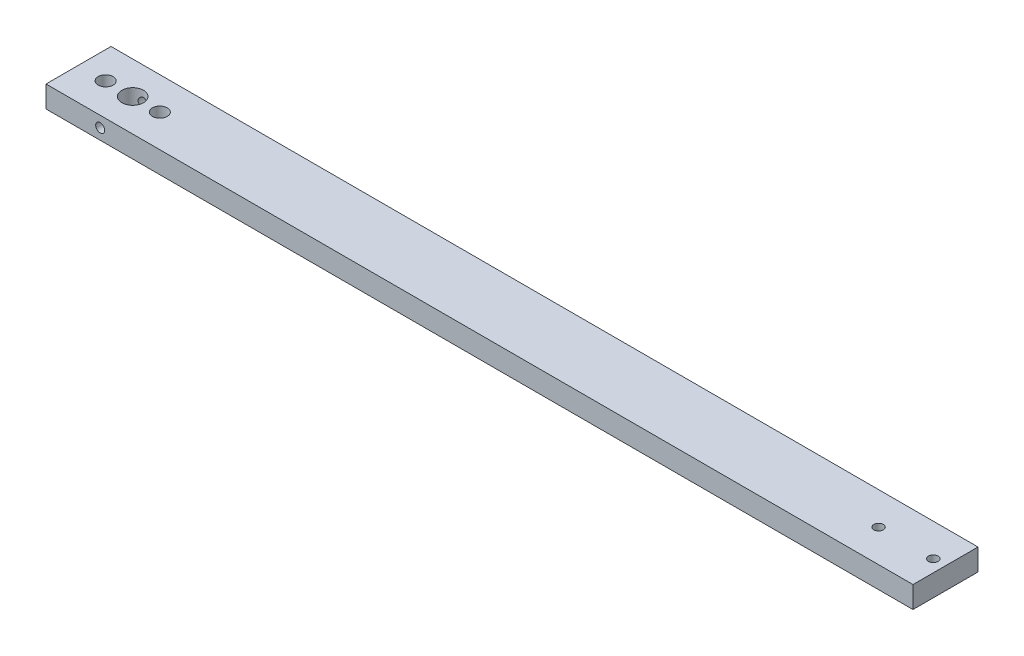
ISO-10303-21;
HEADER;
FILE_DESCRIPTION(('STEP AP214'),'2;1');
FILE_NAME('part.step','',(''),(''),'','','');
FILE_SCHEMA(('AUTOMOTIVE_DESIGN { 1 0 10303 214 1 1 1 1 }'));
ENDSEC;
DATA;
#1=APPLICATION_CONTEXT('core data for automotive mechanical design processes');
#2=APPLICATION_PROTOCOL_DEFINITION('international standard','automotive_design',2000,#1);
#3=PRODUCT_CONTEXT('',#1,'mechanical');
#4=PRODUCT('Part','Part','',(#3));
#5=PRODUCT_RELATED_PRODUCT_CATEGORY('part','',(#4));
#6=PRODUCT_DEFINITION_FORMATION('','',#4);
#7=PRODUCT_DEFINITION_CONTEXT('part definition',#1,'design');
#8=PRODUCT_DEFINITION('design','',#6,#7);
#9=PRODUCT_DEFINITION_SHAPE('','',#8);
#10=(LENGTH_UNIT() NAMED_UNIT(*) SI_UNIT(.MILLI.,.METRE.));
#11=(NAMED_UNIT(*) PLANE_ANGLE_UNIT() SI_UNIT($,.RADIAN.));
#12=(NAMED_UNIT(*) SI_UNIT($,.STERADIAN.) SOLID_ANGLE_UNIT());
#13=UNCERTAINTY_MEASURE_WITH_UNIT(LENGTH_MEASURE(1.E-05),#10,'distance_accuracy_value','');
#14=(GEOMETRIC_REPRESENTATION_CONTEXT(3) GLOBAL_UNCERTAINTY_ASSIGNED_CONTEXT((#13)) GLOBAL_UNIT_ASSIGNED_CONTEXT((#10,
#11,#12)) REPRESENTATION_CONTEXT('',''));
#15=CARTESIAN_POINT('',(0.,0.,0.));
#16=DIRECTION('',(0.,0.,1.));
#17=DIRECTION('',(1.,0.,0.));
#18=AXIS2_PLACEMENT_3D('',#15,#16,#17);
#19=CARTESIAN_POINT('',(300.,-4.,-12.0000000000001));
#20=DIRECTION('',(1.,0.,0.));
#21=DIRECTION('',(0.,0.,-1.));
#22=AXIS2_PLACEMENT_3D('',#19,#20,#21);
#23=PLANE('',#22);
#24=DIRECTION('',(0.,1.,0.));
#25=VECTOR('',#24,1.);
#26=CARTESIAN_POINT('',(300.,-4.,-12.0000000000001));
#27=LINE('',#26,#25);
#28=CARTESIAN_POINT('',(300.,-4.,-12.0000000000001));
#29=VERTEX_POINT('',#28);
#30=CARTESIAN_POINT('',(300.,4.,-12.0000000000001));
#31=VERTEX_POINT('',#30);
#32=EDGE_CURVE('E37',#29,#31,#27,.T.);
#33=ORIENTED_EDGE('',*,*,#32,.T.);
#34=DIRECTION('',(0.,0.,-1.));
#35=VECTOR('',#34,1.);
#36=CARTESIAN_POINT('',(300.,4.,-12.0000000000001));
#37=LINE('',#36,#35);
#38=CARTESIAN_POINT('',(300.,4.,11.9999999999999));
#39=VERTEX_POINT('',#38);
#40=EDGE_CURVE('E74',#39,#31,#37,.T.);
#41=ORIENTED_EDGE('',*,*,#40,.F.);
#42=DIRECTION('',(0.,1.,0.));
#43=VECTOR('',#42,1.);
#44=CARTESIAN_POINT('',(300.,-4.,11.9999999999999));
#45=LINE('',#44,#43);
#46=CARTESIAN_POINT('',(300.,-4.,11.9999999999999));
#47=VERTEX_POINT('',#46);
#48=EDGE_CURVE('E11',#47,#39,#45,.T.);
#49=ORIENTED_EDGE('',*,*,#48,.F.);
#50=DIRECTION('',(0.,0.,-1.));
#51=VECTOR('',#50,1.);
#52=CARTESIAN_POINT('',(300.,-4.,-12.0000000000001));
#53=LINE('',#52,#51);
#54=EDGE_CURVE('E75',#47,#29,#53,.T.);
#55=ORIENTED_EDGE('',*,*,#54,.T.);
#56=EDGE_LOOP('',(#33,#41,#49,#55));
#57=FACE_BOUND('',#56,.T.);
#58=ADVANCED_FACE('F34',(#57),#23,.T.);
#59=CARTESIAN_POINT('',(-20.,-4.,11.9999999999999));
#60=DIRECTION('',(0.,0.,1.));
#61=DIRECTION('',(1.,0.,0.));
#62=AXIS2_PLACEMENT_3D('',#59,#60,#61);
#63=PLANE('',#62);
#64=CARTESIAN_POINT('',(0.,0.,11.9999999999999));
#65=DIRECTION('',(0.,0.,1.));
#66=DIRECTION('',(1.,0.,0.));
#67=AXIS2_PLACEMENT_3D('',#64,#65,#66);
#68=CIRCLE('',#67,1.65);
#69=CARTESIAN_POINT('',(1.65,0.,11.9999999999999));
#70=VERTEX_POINT('',#69);
#71=EDGE_CURVE('E155',#70,#70,#68,.T.);
#72=ORIENTED_EDGE('',*,*,#71,.F.);
#73=EDGE_LOOP('',(#72));
#74=FACE_BOUND('',#73,.T.);
#75=ORIENTED_EDGE('',*,*,#48,.T.);
#76=DIRECTION('',(1.,0.,0.));
#77=VECTOR('',#76,1.);
#78=CARTESIAN_POINT('',(-20.,4.,11.9999999999999));
#79=LINE('',#78,#77);
#80=CARTESIAN_POINT('',(-20.,4.,11.9999999999999));
#81=VERTEX_POINT('',#80);
#82=EDGE_CURVE('E92',#81,#39,#79,.T.);
#83=ORIENTED_EDGE('',*,*,#82,.F.);
#84=DIRECTION('',(0.,1.,0.));
#85=VECTOR('',#84,1.);
#86=CARTESIAN_POINT('',(-20.,-4.,11.9999999999999));
#87=LINE('',#86,#85);
#88=CARTESIAN_POINT('',(-20.,-4.,11.9999999999999));
#89=VERTEX_POINT('',#88);
#90=EDGE_CURVE('E42',#89,#81,#87,.T.);
#91=ORIENTED_EDGE('',*,*,#90,.F.);
#92=DIRECTION('',(1.,0.,0.));
#93=VECTOR('',#92,1.);
#94=CARTESIAN_POINT('',(-20.,-4.,11.9999999999999));
#95=LINE('',#94,#93);
#96=EDGE_CURVE('E80',#89,#47,#95,.T.);
#97=ORIENTED_EDGE('',*,*,#96,.T.);
#98=EDGE_LOOP('',(#75,#83,#91,#97));
#99=FACE_BOUND('',#98,.T.);
#100=ADVANCED_FACE('F127',(#74,#99),#63,.T.);
#101=CARTESIAN_POINT('',(-20.,-4.,-11.9999999999999));
#102=DIRECTION('',(-1.,0.,0.));
#103=DIRECTION('',(0.,0.,1.));
#104=AXIS2_PLACEMENT_3D('',#101,#102,#103);
#105=PLANE('',#104);
#106=ORIENTED_EDGE('',*,*,#90,.T.);
#107=DIRECTION('',(0.,0.,1.));
#108=VECTOR('',#107,1.);
#109=CARTESIAN_POINT('',(-20.,4.,-11.9999999999999));
#110=LINE('',#109,#108);
#111=CARTESIAN_POINT('',(-20.,4.,-11.9999999999999));
#112=VERTEX_POINT('',#111);
#113=EDGE_CURVE('E87',#112,#81,#110,.T.);
#114=ORIENTED_EDGE('',*,*,#113,.F.);
#115=DIRECTION('',(0.,1.,0.));
#116=VECTOR('',#115,1.);
#117=CARTESIAN_POINT('',(-20.,-4.,-11.9999999999999));
#118=LINE('',#117,#116);
#119=CARTESIAN_POINT('',(-20.,-4.,-11.9999999999999));
#120=VERTEX_POINT('',#119);
#121=EDGE_CURVE('E79',#120,#112,#118,.T.);
#122=ORIENTED_EDGE('',*,*,#121,.F.);
#123=DIRECTION('',(0.,0.,1.));
#124=VECTOR('',#123,1.);
#125=CARTESIAN_POINT('',(-20.,-4.,-11.9999999999999));
#126=LINE('',#125,#124);
#127=EDGE_CURVE('E120',#120,#89,#126,.T.);
#128=ORIENTED_EDGE('',*,*,#127,.T.);
#129=EDGE_LOOP('',(#106,#114,#122,#128));
#130=FACE_BOUND('',#129,.T.);
#131=ADVANCED_FACE('F124',(#130),#105,.T.);
#132=CARTESIAN_POINT('',(-20.,-4.,-11.9999999999999));
#133=DIRECTION('',(0.,0.,-1.));
#134=DIRECTION('',(-1.,0.,0.));
#135=AXIS2_PLACEMENT_3D('',#132,#133,#134);
#136=PLANE('',#135);
#137=CARTESIAN_POINT('',(0.,0.,-11.9999999999999));
#138=DIRECTION('',(0.,0.,-1.));
#139=DIRECTION('',(-1.,0.,0.));
#140=AXIS2_PLACEMENT_3D('',#137,#138,#139);
#141=CIRCLE('',#140,1.64999999999999);
#142=CARTESIAN_POINT('',(-1.65,0.,-11.9999999999999));
#143=VERTEX_POINT('',#142);
#144=EDGE_CURVE('E164',#143,#143,#141,.T.);
#145=ORIENTED_EDGE('',*,*,#144,.F.);
#146=EDGE_LOOP('',(#145));
#147=FACE_BOUND('',#146,.T.);
#148=ORIENTED_EDGE('',*,*,#121,.T.);
#149=DIRECTION('',(-1.,0.,0.));
#150=VECTOR('',#149,1.);
#151=CARTESIAN_POINT('',(-20.,4.,-11.9999999999999));
#152=LINE('',#151,#150);
#153=EDGE_CURVE('E82',#31,#112,#152,.T.);
#154=ORIENTED_EDGE('',*,*,#153,.F.);
#155=ORIENTED_EDGE('',*,*,#32,.F.);
#156=DIRECTION('',(-1.,0.,0.));
#157=VECTOR('',#156,1.);
#158=CARTESIAN_POINT('',(-20.,-4.,-11.9999999999999));
#159=LINE('',#158,#157);
#160=EDGE_CURVE('E118',#29,#120,#159,.T.);
#161=ORIENTED_EDGE('',*,*,#160,.T.);
#162=EDGE_LOOP('',(#148,#154,#155,#161));
#163=FACE_BOUND('',#162,.T.);
#164=ADVANCED_FACE('F83',(#147,#163),#136,.T.);
#165=CARTESIAN_POINT('',(0.,-4.,0.));
#166=DIRECTION('',(0.,1.,0.));
#167=DIRECTION('',(0.,0.,1.));
#168=AXIS2_PLACEMENT_3D('',#165,#166,#167);
#169=PLANE('',#168);
#170=CARTESIAN_POINT('',(0.,-4.,0.));
#171=DIRECTION('',(0.,1.,0.));
#172=DIRECTION('',(0.,0.,1.));
#173=AXIS2_PLACEMENT_3D('',#170,#171,#172);
#174=CIRCLE('',#173,4.);
#175=CARTESIAN_POINT('',(0.,-4.,4.));
#176=VERTEX_POINT('',#175);
#177=EDGE_CURVE('E102',#176,#176,#174,.T.);
#178=ORIENTED_EDGE('',*,*,#177,.T.);
#179=EDGE_LOOP('',(#178));
#180=FACE_BOUND('',#179,.T.);
#181=CARTESIAN_POINT('',(10.,-4.,0.));
#182=DIRECTION('',(0.,1.,0.));
#183=DIRECTION('',(0.,0.,-1.));
#184=AXIS2_PLACEMENT_3D('',#181,#182,#183);
#185=CIRCLE('',#184,2.75);
#186=CARTESIAN_POINT('',(10.,-4.,-2.75));
#187=VERTEX_POINT('',#186);
#188=EDGE_CURVE('E105',#187,#187,#185,.T.);
#189=ORIENTED_EDGE('',*,*,#188,.T.);
#190=EDGE_LOOP('',(#189));
#191=FACE_BOUND('',#190,.T.);
#192=CARTESIAN_POINT('',(-10.,-4.,0.));
#193=DIRECTION('',(0.,1.,0.));
#194=DIRECTION('',(0.,0.,1.));
#195=AXIS2_PLACEMENT_3D('',#192,#193,#194);
#196=CIRCLE('',#195,2.75);
#197=CARTESIAN_POINT('',(-10.,-4.,2.75));
#198=VERTEX_POINT('',#197);
#199=EDGE_CURVE('E108',#198,#198,#196,.T.);
#200=ORIENTED_EDGE('',*,*,#199,.T.);
#201=EDGE_LOOP('',(#200));
#202=FACE_BOUND('',#201,.T.);
#203=CARTESIAN_POINT('',(275.3,-4.,0.));
#204=DIRECTION('',(0.,1.,0.));
#205=DIRECTION('',(0.,0.,1.));
#206=AXIS2_PLACEMENT_3D('',#203,#204,#205);
#207=CIRCLE('',#206,1.74999999999998);
#208=CARTESIAN_POINT('',(275.3,-4.,1.74999999999995));
#209=VERTEX_POINT('',#208);
#210=EDGE_CURVE('E111',#209,#209,#207,.T.);
#211=ORIENTED_EDGE('',*,*,#210,.T.);
#212=EDGE_LOOP('',(#211));
#213=FACE_BOUND('',#212,.T.);
#214=CARTESIAN_POINT('',(295.5,-4.,0.));
#215=DIRECTION('',(0.,1.,0.));
#216=DIRECTION('',(0.,0.,1.));
#217=AXIS2_PLACEMENT_3D('',#214,#215,#216);
#218=CIRCLE('',#217,1.74999999999998);
#219=CARTESIAN_POINT('',(295.5,-4.,1.74999999999994));
#220=VERTEX_POINT('',#219);
#221=EDGE_CURVE('E114',#220,#220,#218,.T.);
#222=ORIENTED_EDGE('',*,*,#221,.T.);
#223=EDGE_LOOP('',(#222));
#224=FACE_BOUND('',#223,.T.);
#225=ORIENTED_EDGE('',*,*,#54,.F.);
#226=ORIENTED_EDGE('',*,*,#96,.F.);
#227=ORIENTED_EDGE('',*,*,#127,.F.);
#228=ORIENTED_EDGE('',*,*,#160,.F.);
#229=EDGE_LOOP('',(#225,#226,#227,#228));
#230=FACE_BOUND('',#229,.T.);
#231=ADVANCED_FACE('F129',(#180,#191,#202,#213,#224,#230),#169,.F.);
#232=CARTESIAN_POINT('',(295.5,-4.,0.));
#233=DIRECTION('',(0.,1.,0.));
#234=DIRECTION('',(0.,0.,1.));
#235=AXIS2_PLACEMENT_3D('',#232,#233,#234);
#236=CYLINDRICAL_SURFACE('',#235,1.74999999999998);
#237=ORIENTED_EDGE('',*,*,#221,.F.);
#238=EDGE_LOOP('',(#237));
#239=FACE_BOUND('',#238,.T.);
#240=CARTESIAN_POINT('',(295.5,4.,0.));
#241=DIRECTION('',(0.,1.,0.));
#242=DIRECTION('',(0.,0.,1.));
#243=AXIS2_PLACEMENT_3D('',#240,#241,#242);
#244=CIRCLE('',#243,1.74999999999998);
#245=CARTESIAN_POINT('',(295.5,4.,1.74999999999994));
#246=VERTEX_POINT('',#245);
#247=EDGE_CURVE('E93',#246,#246,#244,.T.);
#248=ORIENTED_EDGE('',*,*,#247,.T.);
#249=EDGE_LOOP('',(#248));
#250=FACE_BOUND('',#249,.T.);
#251=ADVANCED_FACE('F131',(#239,#250),#236,.F.);
#252=CARTESIAN_POINT('',(275.3,-4.,0.));
#253=DIRECTION('',(0.,1.,0.));
#254=DIRECTION('',(0.,0.,1.));
#255=AXIS2_PLACEMENT_3D('',#252,#253,#254);
#256=CYLINDRICAL_SURFACE('',#255,1.74999999999998);
#257=ORIENTED_EDGE('',*,*,#210,.F.);
#258=EDGE_LOOP('',(#257));
#259=FACE_BOUND('',#258,.T.);
#260=CARTESIAN_POINT('',(275.3,4.,0.));
#261=DIRECTION('',(0.,1.,0.));
#262=DIRECTION('',(0.,0.,1.));
#263=AXIS2_PLACEMENT_3D('',#260,#261,#262);
#264=CIRCLE('',#263,1.74999999999998);
#265=CARTESIAN_POINT('',(275.3,4.,1.74999999999995));
#266=VERTEX_POINT('',#265);
#267=EDGE_CURVE('E96',#266,#266,#264,.T.);
#268=ORIENTED_EDGE('',*,*,#267,.T.);
#269=EDGE_LOOP('',(#268));
#270=FACE_BOUND('',#269,.T.);
#271=ADVANCED_FACE('F138',(#259,#270),#256,.F.);
#272=CARTESIAN_POINT('',(-10.,-4.,0.));
#273=DIRECTION('',(0.,1.,0.));
#274=DIRECTION('',(0.,0.,1.));
#275=AXIS2_PLACEMENT_3D('',#272,#273,#274);
#276=CYLINDRICAL_SURFACE('',#275,2.75);
#277=ORIENTED_EDGE('',*,*,#199,.F.);
#278=EDGE_LOOP('',(#277));
#279=FACE_BOUND('',#278,.T.);
#280=CARTESIAN_POINT('',(-10.,4.,0.));
#281=DIRECTION('',(0.,1.,0.));
#282=DIRECTION('',(0.,0.,1.));
#283=AXIS2_PLACEMENT_3D('',#280,#281,#282);
#284=CIRCLE('',#283,2.75);
#285=CARTESIAN_POINT('',(-10.,4.,2.75));
#286=VERTEX_POINT('',#285);
#287=EDGE_CURVE('E209',#286,#286,#284,.T.);
#288=ORIENTED_EDGE('',*,*,#287,.T.);
#289=EDGE_LOOP('',(#288));
#290=FACE_BOUND('',#289,.T.);
#291=ADVANCED_FACE('F225',(#279,#290),#276,.F.);
#292=CARTESIAN_POINT('',(10.,-4.,0.));
#293=DIRECTION('',(0.,1.,0.));
#294=DIRECTION('',(0.,0.,1.));
#295=AXIS2_PLACEMENT_3D('',#292,#293,#294);
#296=CYLINDRICAL_SURFACE('',#295,2.75);
#297=ORIENTED_EDGE('',*,*,#188,.F.);
#298=EDGE_LOOP('',(#297));
#299=FACE_BOUND('',#298,.T.);
#300=CARTESIAN_POINT('',(10.,4.,0.));
#301=DIRECTION('',(0.,1.,0.));
#302=DIRECTION('',(0.,0.,-1.));
#303=AXIS2_PLACEMENT_3D('',#300,#301,#302);
#304=CIRCLE('',#303,2.75);
#305=CARTESIAN_POINT('',(10.,4.,-2.75));
#306=VERTEX_POINT('',#305);
#307=EDGE_CURVE('E207',#306,#306,#304,.T.);
#308=ORIENTED_EDGE('',*,*,#307,.T.);
#309=EDGE_LOOP('',(#308));
#310=FACE_BOUND('',#309,.T.);
#311=ADVANCED_FACE('F198',(#299,#310),#296,.F.);
#312=CARTESIAN_POINT('',(0.,-4.,0.));
#313=DIRECTION('',(0.,1.,0.));
#314=DIRECTION('',(0.,0.,1.));
#315=AXIS2_PLACEMENT_3D('',#312,#313,#314);
#316=CYLINDRICAL_SURFACE('',#315,4.);
#317=CARTESIAN_POINT('',(-1.65,0.,-3.64383040220041));
#318=CARTESIAN_POINT('',(-1.64999056813102,-0.0880964802256831,-3.64383945275153));
#319=CARTESIAN_POINT('',(-1.64289989177358,-0.176340431973593,-3.64707173267573));
#320=CARTESIAN_POINT('',(-1.61480845546373,-0.350287061078878,-3.65959209124688));
#321=CARTESIAN_POINT('',(-1.5937695789634,-0.435982100597601,-3.66889676295874));
#322=CARTESIAN_POINT('',(-1.53873536249638,-0.602002938130631,-3.69231325052125));
#323=CARTESIAN_POINT('',(-1.50479212400174,-0.682348820218595,-3.70640571161012));
#324=CARTESIAN_POINT('',(-1.42506535594207,-0.836181766834221,-3.73778230052357));
#325=CARTESIAN_POINT('',(-1.37928479159595,-0.909670542784032,-3.75506562873472));
#326=CARTESIAN_POINT('',(-1.27419856290372,-1.0522286878465,-3.7920553041855));
#327=CARTESIAN_POINT('',(-1.2142851824136,-1.1208292557802,-3.81184277704779));
#328=CARTESIAN_POINT('',(-1.08391072165483,-1.24735477190875,-3.85094363418238));
#329=CARTESIAN_POINT('',(-1.01344563996365,-1.30527565147222,-3.87025683535296));
#330=CARTESIAN_POINT('',(-0.860301943593386,-1.41117137130186,-3.90721575035942));
#331=CARTESIAN_POINT('',(-0.777232390113595,-1.45862093270615,-3.92475616703247));
#332=CARTESIAN_POINT('',(-0.603436361875862,-1.5386701453217,-3.95520283117798));
#333=CARTESIAN_POINT('',(-0.51271324251305,-1.57127626434656,-3.96811109652272));
#334=CARTESIAN_POINT('',(-0.331105172304404,-1.61902070665622,-3.98726403378776));
#335=CARTESIAN_POINT('',(-0.240465625184498,-1.63496684792323,-3.99381564337609));
#336=CARTESIAN_POINT('',(-0.0575763551498719,-1.65154665185517,-4.0006306156112));
#337=CARTESIAN_POINT('',(0.0346727137709482,-1.652186395322,-4.00089647540932));
#338=CARTESIAN_POINT('',(0.212297380895978,-1.6385635038634,-3.99529224160632));
#339=CARTESIAN_POINT('',(0.297754665400389,-1.6251878162829,-3.98978733384658));
#340=CARTESIAN_POINT('',(0.465085845235271,-1.58543118255224,-3.97375926025945));
#341=CARTESIAN_POINT('',(0.546959476205484,-1.55904927870931,-3.96323572489496));
#342=CARTESIAN_POINT('',(0.706295606817221,-1.49371233827981,-3.93798907731603));
#343=CARTESIAN_POINT('',(0.783671979762461,-1.45457201007513,-3.92320447216363));
#344=CARTESIAN_POINT('',(0.930960489992457,-1.36500872081339,-3.89088763760773));
#345=CARTESIAN_POINT('',(1.00086999453931,-1.31458179949669,-3.87335444442337));
#346=CARTESIAN_POINT('',(1.1363853094704,-1.19981176097136,-3.83587133640027));
#347=CARTESIAN_POINT('',(1.20135746318644,-1.13474658910127,-3.8158381454309));
#348=CARTESIAN_POINT('',(1.31973838423492,-0.994590333678422,-3.77653142784556));
#349=CARTESIAN_POINT('',(1.37314286572201,-0.919495550736696,-3.75725818494773));
#350=CARTESIAN_POINT('',(1.46845339844827,-0.758401596452683,-3.7210660715691));
#351=CARTESIAN_POINT('',(1.50994179309275,-0.672132428307348,-3.70424107982558));
#352=CARTESIAN_POINT('',(1.57754508127094,-0.492953328594103,-3.67596385006486));
#353=CARTESIAN_POINT('',(1.6036707120612,-0.400048086126184,-3.66450786071418));
#354=CARTESIAN_POINT('',(1.6382132035594,-0.216577104815015,-3.64919091711419));
#355=CARTESIAN_POINT('',(1.6476556945468,-0.126241698817141,-3.64489111171832));
#356=CARTESIAN_POINT('',(1.65157101672825,0.0548056296985967,-3.64311980380968));
#357=CARTESIAN_POINT('',(1.646048857804,0.145517416059281,-3.6456460160745));
#358=CARTESIAN_POINT('',(1.62112710501825,0.31880100904947,-3.65678944366162));
#359=CARTESIAN_POINT('',(1.60261202118541,0.401528179674606,-3.66501803861665));
#360=CARTESIAN_POINT('',(1.55339580262014,0.56263706437997,-3.68614612916708));
#361=CARTESIAN_POINT('',(1.52269185697122,0.641017771351656,-3.69904670212357));
#362=CARTESIAN_POINT('',(1.44853902204983,0.794879005695634,-3.72872477858183));
#363=CARTESIAN_POINT('',(1.40460979308263,0.870100194779243,-3.74564214050946));
#364=CARTESIAN_POINT('',(1.3057345540945,1.01246016942973,-3.78124523189864));
#365=CARTESIAN_POINT('',(1.25078384473682,1.07959548773512,-3.79993171387674));
#366=CARTESIAN_POINT('',(1.12627542162097,1.20942962644671,-3.83876011670653));
#367=CARTESIAN_POINT('',(1.05590387126703,1.27135173704871,-3.85889967217623));
#368=CARTESIAN_POINT('',(0.905297980080092,1.38264285566206,-3.89698114804694));
#369=CARTESIAN_POINT('',(0.825063002026892,1.43201105200319,-3.91492292631237));
#370=CARTESIAN_POINT('',(0.656516816883257,1.51670413420678,-3.94668767391886));
#371=CARTESIAN_POINT('',(0.568191273870482,1.55200347500272,-3.96050313975064));
#372=CARTESIAN_POINT('',(0.386140833605168,1.60699165685874,-3.98237104121021));
#373=CARTESIAN_POINT('',(0.292419112817552,1.62668958293893,-3.9904268305481));
#374=CARTESIAN_POINT('',(0.109187189544828,1.64878822892048,-3.9994889299446));
#375=CARTESIAN_POINT('',(0.0198303081186289,1.65228482874193,-4.00094173424749));
#376=CARTESIAN_POINT('',(-0.158161739195417,1.64481456562971,-3.99786220239438));
#377=CARTESIAN_POINT('',(-0.246797024648485,1.63385015000454,-3.99333087896147));
#378=CARTESIAN_POINT('',(-0.417705375935882,1.59855535786443,-3.979024148364));
#379=CARTESIAN_POINT('',(-0.500092371627857,1.57469555788544,-3.96943363922013));
#380=CARTESIAN_POINT('',(-0.659667355734165,1.51479588512,-3.94605480923816));
#381=CARTESIAN_POINT('',(-0.736854343148748,1.47875367521331,-3.93226568297162));
#382=CARTESIAN_POINT('',(-0.887661133732622,1.39369547331361,-3.90105808483759));
#383=CARTESIAN_POINT('',(-0.960964214361153,1.34416874322707,-3.88350423911689));
#384=CARTESIAN_POINT('',(-1.09852932170705,1.23429715321,-3.84685709666619));
#385=CARTESIAN_POINT('',(-1.1627880603165,1.17394837691919,-3.82776324400832));
#386=CARTESIAN_POINT('',(-1.28487769945047,1.03941247264534,-3.78859741195738));
#387=CARTESIAN_POINT('',(-1.34199767947157,0.964572243115058,-3.76854475207571));
#388=CARTESIAN_POINT('',(-1.4429647467733,0.80573402431893,-3.73105419200533));
#389=CARTESIAN_POINT('',(-1.48680449811903,0.721731008290407,-3.7136177396712));
#390=CARTESIAN_POINT('',(-1.55944447766651,0.547271558730101,-3.68370387904713));
#391=CARTESIAN_POINT('',(-1.58834112875234,0.4568608919089,-3.67119480418034));
#392=CARTESIAN_POINT('',(-1.63017263567573,0.271952855921638,-3.65281837075147));
#393=CARTESIAN_POINT('',(-1.64316103312974,0.177470309123126,-3.64692873900432));
#394=CARTESIAN_POINT('',(-1.6493120932942,0.0551366863573543,-3.64414054419779));
#395=CARTESIAN_POINT('',(-1.6500029523216,0.0275755677149816,-3.64382756923722));
#396=CARTESIAN_POINT('',(-1.65,0.,-3.64383040220041));
#397=B_SPLINE_CURVE_WITH_KNOTS('',3,(#317,#318,#319,#320,#321,#322,#323,#324,#325,#326,#327,
#328,#329,#330,#331,#332,#333,#334,#335,#336,#337,#338,#339,#340,#341,#342,#343,#344,#345,#346,
#347,#348,#349,#350,#351,#352,#353,#354,#355,#356,#357,#358,#359,#360,#361,#362,#363,#364,#365,
#366,#367,#368,#369,#370,#371,#372,#373,#374,#375,#376,#377,#378,#379,#380,#381,#382,#383,#384,
#385,#386,#387,#388,#389,#390,#391,#392,#393,#394,#395,#396),.UNSPECIFIED.,.T.,.F.,(4,2,2,2,2,2,
2,2,2,2,2,2,2,2,2,2,2,2,2,2,2,2,2,2,2,2,2,2,2,2,2,2,2,2,2,2,2,2,2,4),(0.,0.264211724660743,
0.529148459018595,0.793026677872045,1.05683885985755,1.33523297260791,1.61373292676209,
1.90403076094907,2.19420198072698,2.46953816244269,2.74476495901023,3.00356896819765,
3.2623920368679,3.52515526924738,3.78801084539544,4.06907613148063,4.35024537535723,
4.64031806272421,4.93018777241108,5.20152035698261,5.4727621157604,5.72713321026164,
5.98156300028878,6.24665916965706,6.51186861189121,6.79815687284344,7.0844636389886,
7.37128791456167,7.65794504349147,7.92489841526076,8.19180661499932,8.44957452423756,
8.70739191275384,8.97680852354691,9.24632283025303,9.53374725602171,9.82133016535512,
10.1070334851925,10.3917725616093,10.4744749384331),.UNSPECIFIED.);
#398=CARTESIAN_POINT('',(-1.65,0.,-3.64383040220041));
#399=VERTEX_POINT('',#398);
#400=EDGE_CURVE('E158',#399,#399,#397,.T.);
#401=ORIENTED_EDGE('',*,*,#400,.F.);
#402=EDGE_LOOP('',(#401));
#403=FACE_BOUND('',#402,.T.);
#404=CARTESIAN_POINT('',(0.,-1.65,4.));
#405=CARTESIAN_POINT('',(0.0884596783632788,-1.64999078279337,3.99999309817074));
#406=CARTESIAN_POINT('',(0.177062252057582,-1.64284398565668,3.99703145792172));
#407=CARTESIAN_POINT('',(0.351759669836409,-1.6145088580631,3.9854711320255));
#408=CARTESIAN_POINT('',(0.43784727199696,-1.59328348897568,3.97685757767606));
#409=CARTESIAN_POINT('',(0.604702496902741,-1.53770518779811,3.95491965529936));
#410=CARTESIAN_POINT('',(0.685486934491196,-1.50339635664654,3.94161112398211));
#411=CARTESIAN_POINT('',(0.840076633223487,-1.42280524215057,3.91158286286531));
#412=CARTESIAN_POINT('',(0.913884076117566,-1.37652671882984,3.89486420463244));
#413=CARTESIAN_POINT('',(1.05618769598525,-1.27089324535595,3.85876900012149));
#414=CARTESIAN_POINT('',(1.12429373957476,-1.21104232975103,3.83930654387258));
#415=CARTESIAN_POINT('',(1.24983574384757,-1.08101116034103,3.80029483347099));
#416=CARTESIAN_POINT('',(1.30726618926957,-1.01082560078819,3.78074553976622));
#417=CARTESIAN_POINT('',(1.41254826809049,-0.858031751128288,3.74272551686067));
#418=CARTESIAN_POINT('',(1.45980781790561,-0.774988884693477,3.72435159658093));
#419=CARTESIAN_POINT('',(1.53951358199407,-0.601263690709819,3.69212136090386));
#420=CARTESIAN_POINT('',(1.57196727712791,-0.510585248636992,3.67826276509115));
#421=CARTESIAN_POINT('',(1.61953738222492,-0.32865200299817,3.65756021871623));
#422=CARTESIAN_POINT('',(1.63540371417153,-0.237628927856929,3.65041449103236));
#423=CARTESIAN_POINT('',(1.65168918120803,-0.0539534926347216,3.64307714795703));
#424=CARTESIAN_POINT('',(1.65211659474,0.0386979676293035,3.64288180572738));
#425=CARTESIAN_POINT('',(1.6380778077983,0.215598886618723,3.64921138579605));
#426=CARTESIAN_POINT('',(1.62472398487459,0.299958158749157,3.6552343974104));
#427=CARTESIAN_POINT('',(1.58536484231198,0.465110284381171,3.67247532251837));
#428=CARTESIAN_POINT('',(1.55935715587185,0.545902467603298,3.68369420783859));
#429=CARTESIAN_POINT('',(1.49492412942489,0.703645108758622,3.71031458481431));
#430=CARTESIAN_POINT('',(1.45624866973017,0.780478737808331,3.72579923184191));
#431=CARTESIAN_POINT('',(1.36775445443624,0.926860232460035,3.75918616236907));
#432=CARTESIAN_POINT('',(1.31793135478159,0.99640524224915,3.77708938726885));
#433=CARTESIAN_POINT('',(1.20371911924869,1.13228640778781,3.81509742396095));
#434=CARTESIAN_POINT('',(1.13846630094389,1.19788195770326,3.8352618825369));
#435=CARTESIAN_POINT('',(0.997682554866215,1.31744467444138,3.87426910607353));
#436=CARTESIAN_POINT('',(0.922149319847433,1.37140922386084,3.8931115728953));
#437=CARTESIAN_POINT('',(0.760736369737324,1.46723477358504,3.92787932271737));
#438=CARTESIAN_POINT('',(0.674664094072236,1.50880028319418,3.94373050716791));
#439=CARTESIAN_POINT('',(0.495928253552977,1.57660302410888,3.97016319816605));
#440=CARTESIAN_POINT('',(0.403268287372385,1.60284855321117,3.98074755693754));
#441=CARTESIAN_POINT('',(0.220181304317673,1.63772950367822,3.99492450637935));
#442=CARTESIAN_POINT('',(0.129974172308222,1.64735917793593,3.99891121146315));
#443=CARTESIAN_POINT('',(-0.0508474401522217,1.6516920437633,4.00069746426785));
#444=CARTESIAN_POINT('',(-0.141461799500566,1.64639941310822,3.99849874371343));
#445=CARTESIAN_POINT('',(-0.315907755487548,1.62175473175704,3.98841747083847));
#446=CARTESIAN_POINT('',(-0.399855317526684,1.60309592665991,3.9808153168881));
#447=CARTESIAN_POINT('',(-0.563340473329574,1.55320790366289,3.96098887803091));
#448=CARTESIAN_POINT('',(-0.642877505872146,1.52197709018521,3.94876400644332));
#449=CARTESIAN_POINT('',(-0.798061975964474,1.44681062001911,3.92039728883464));
#450=CARTESIAN_POINT('',(-0.873512656660506,1.40251143824378,3.90414585630856));
#451=CARTESIAN_POINT('',(-1.01617847320907,1.30286606574213,3.86946768187548));
#452=CARTESIAN_POINT('',(-1.0833901834211,1.24751530491016,3.85104004134398));
#453=CARTESIAN_POINT('',(-1.21261994292741,1.12279569518803,3.8124029584454));
#454=CARTESIAN_POINT('',(-1.27394364561822,1.0527161759607,3.79215916493832));
#455=CARTESIAN_POINT('',(-1.38414835482505,0.902928709391473,3.75333928940831));
#456=CARTESIAN_POINT('',(-1.43302674162727,0.823218740057447,3.73476355904109));
#457=CARTESIAN_POINT('',(-1.51742282291387,0.654904629466687,3.70128700339843));
#458=CARTESIAN_POINT('',(-1.55275802936534,0.566198083991944,3.68643724424496));
#459=CARTESIAN_POINT('',(-1.60769618165394,0.383290834021757,3.66281640168181));
#460=CARTESIAN_POINT('',(-1.62731175174753,0.289094603581827,3.65404044124936));
#461=CARTESIAN_POINT('',(-1.64901123940268,0.105569726841935,3.64429559365239));
#462=CARTESIAN_POINT('',(-1.65231049364125,0.0164127805420612,3.64278573581523));
#463=CARTESIAN_POINT('',(-1.64451485356567,-0.161128470759179,3.64631178238903));
#464=CARTESIAN_POINT('',(-1.6334220656173,-0.249512886919371,3.65134672892697));
#465=CARTESIAN_POINT('',(-1.59817118006572,-0.418933071257697,3.666904904187));
#466=CARTESIAN_POINT('',(-1.57461958437454,-0.50012071142211,3.67717261200251));
#467=CARTESIAN_POINT('',(-1.51570599472927,-0.657414522474084,3.70184411206584));
#468=CARTESIAN_POINT('',(-1.48034069596893,-0.73351926429761,3.7162490615217));
#469=CARTESIAN_POINT('',(-1.3963806225379,-0.883422038241397,3.7486340889516));
#470=CARTESIAN_POINT('',(-1.34712443599271,-0.956814071021409,3.76677577854003));
#471=CARTESIAN_POINT('',(-1.23771718137822,-1.09467168726428,3.80412864636709));
#472=CARTESIAN_POINT('',(-1.17756245772962,-1.15913426277442,3.82334018195056));
#473=CARTESIAN_POINT('',(-1.04300738755744,-1.28199413870367,3.86230172013188));
#474=CARTESIAN_POINT('',(-0.967900110730177,-1.33963922360553,3.88199359359226));
#475=CARTESIAN_POINT('',(-0.808343463182035,-1.44154015953872,3.91832426905579));
#476=CARTESIAN_POINT('',(-0.723889843442852,-1.4857898863659,3.9349616732268));
#477=CARTESIAN_POINT('',(-0.54941476010963,-1.55866373983474,3.96305691394126));
#478=CARTESIAN_POINT('',(-0.459513381649427,-1.58754242535855,3.97459855421812));
#479=CARTESIAN_POINT('',(-0.275719229213243,-1.62951108478514,3.99154438775475));
#480=CARTESIAN_POINT('',(-0.181839966818031,-1.64265066624545,3.99696786149576));
#481=CARTESIAN_POINT('',(-0.0584442952271971,-1.64922677033004,3.99968194626838));
#482=CARTESIAN_POINT('',(-0.0292299486703384,-1.65000304566421,4.00000228058838));
#483=CARTESIAN_POINT('',(0.,-1.65,4.));
#484=B_SPLINE_CURVE_WITH_KNOTS('',3,(#404,#405,#406,#407,#408,#409,#410,#411,#412,#413,#414,
#415,#416,#417,#418,#419,#420,#421,#422,#423,#424,#425,#426,#427,#428,#429,#430,#431,#432,#433,
#434,#435,#436,#437,#438,#439,#440,#441,#442,#443,#444,#445,#446,#447,#448,#449,#450,#451,#452,
#453,#454,#455,#456,#457,#458,#459,#460,#461,#462,#463,#464,#465,#466,#467,#468,#469,#470,#471,
#472,#473,#474,#475,#476,#477,#478,#479,#480,#481,#482,#483),.UNSPECIFIED.,.T.,.F.,(4,2,2,2,2,2,
2,2,2,2,2,2,2,2,2,2,2,2,2,2,2,2,2,2,2,2,2,2,2,2,2,2,2,2,2,2,2,2,2,4),(0.,0.26529709877062,
0.53129493790666,0.79640398149888,1.06142984766523,1.33841878994456,1.61555043582129,
1.90598404924538,2.19627075414925,2.47277648539421,2.7491339503796,3.00480633611683,
3.26052656166861,3.52163539301341,3.78284615202015,4.06565185095456,4.34852112528509,
4.63767392136376,4.92666995726767,5.19768149557686,5.46861716672805,5.72643264660554,
5.98428085748384,6.25011488704506,6.51605907418432,6.80064580250402,7.08529238632159,
7.37364985225781,7.66177550895676,7.92807823226724,8.19434198489785,8.4486977209856,
8.70312467109945,8.9726747998471,9.24231550885213,9.53104085816542,9.81989801073179,
10.1038095613048,10.3868238858899,10.4744866574818),.UNSPECIFIED.);
#485=CARTESIAN_POINT('',(0.,-1.65,4.));
#486=VERTEX_POINT('',#485);
#487=EDGE_CURVE('E157',#486,#486,#484,.T.);
#488=ORIENTED_EDGE('',*,*,#487,.T.);
#489=EDGE_LOOP('',(#488));
#490=FACE_BOUND('',#489,.T.);
#491=ORIENTED_EDGE('',*,*,#177,.F.);
#492=EDGE_LOOP('',(#491));
#493=FACE_BOUND('',#492,.T.);
#494=CARTESIAN_POINT('',(0.,4.,0.));
#495=DIRECTION('',(0.,1.,0.));
#496=DIRECTION('',(0.,0.,1.));
#497=AXIS2_PLACEMENT_3D('',#494,#495,#496);
#498=CIRCLE('',#497,4.);
#499=CARTESIAN_POINT('',(0.,4.,4.));
#500=VERTEX_POINT('',#499);
#501=EDGE_CURVE('E161',#500,#500,#498,.T.);
#502=ORIENTED_EDGE('',*,*,#501,.T.);
#503=EDGE_LOOP('',(#502));
#504=FACE_BOUND('',#503,.T.);
#505=ADVANCED_FACE('F195',(#403,#490,#493,#504),#316,.F.);
#506=CARTESIAN_POINT('',(0.,4.,0.));
#507=DIRECTION('',(0.,1.,0.));
#508=DIRECTION('',(0.,0.,1.));
#509=AXIS2_PLACEMENT_3D('',#506,#507,#508);
#510=PLANE('',#509);
#511=ORIENTED_EDGE('',*,*,#307,.F.);
#512=EDGE_LOOP('',(#511));
#513=FACE_BOUND('',#512,.T.);
#514=ORIENTED_EDGE('',*,*,#267,.F.);
#515=EDGE_LOOP('',(#514));
#516=FACE_BOUND('',#515,.T.);
#517=ORIENTED_EDGE('',*,*,#40,.T.);
#518=ORIENTED_EDGE('',*,*,#153,.T.);
#519=ORIENTED_EDGE('',*,*,#113,.T.);
#520=ORIENTED_EDGE('',*,*,#82,.T.);
#521=EDGE_LOOP('',(#517,#518,#519,#520));
#522=FACE_BOUND('',#521,.T.);
#523=ORIENTED_EDGE('',*,*,#247,.F.);
#524=EDGE_LOOP('',(#523));
#525=FACE_BOUND('',#524,.T.);
#526=ORIENTED_EDGE('',*,*,#287,.F.);
#527=EDGE_LOOP('',(#526));
#528=FACE_BOUND('',#527,.T.);
#529=ORIENTED_EDGE('',*,*,#501,.F.);
#530=EDGE_LOOP('',(#529));
#531=FACE_BOUND('',#530,.T.);
#532=ADVANCED_FACE('F90',(#513,#516,#522,#525,#528,#531),#510,.T.);
#533=CARTESIAN_POINT('',(0.,0.,11.9999999999999));
#534=DIRECTION('',(0.,0.,1.));
#535=DIRECTION('',(1.,0.,0.));
#536=AXIS2_PLACEMENT_3D('',#533,#534,#535);
#537=CYLINDRICAL_SURFACE('',#536,1.65);
#538=ORIENTED_EDGE('',*,*,#487,.F.);
#539=EDGE_LOOP('',(#538));
#540=FACE_BOUND('',#539,.T.);
#541=ORIENTED_EDGE('',*,*,#71,.T.);
#542=EDGE_LOOP('',(#541));
#543=FACE_BOUND('',#542,.T.);
#544=ADVANCED_FACE('F175',(#540,#543),#537,.F.);
#545=CARTESIAN_POINT('',(0.,0.,-11.9999999999999));
#546=DIRECTION('',(0.,0.,-1.));
#547=DIRECTION('',(-1.,0.,0.));
#548=AXIS2_PLACEMENT_3D('',#545,#546,#547);
#549=CYLINDRICAL_SURFACE('',#548,1.64999999999999);
#550=ORIENTED_EDGE('',*,*,#400,.T.);
#551=EDGE_LOOP('',(#550));
#552=FACE_BOUND('',#551,.T.);
#553=ORIENTED_EDGE('',*,*,#144,.T.);
#554=EDGE_LOOP('',(#553));
#555=FACE_BOUND('',#554,.T.);
#556=ADVANCED_FACE('F179',(#552,#555),#549,.F.);
#557=CLOSED_SHELL('',(#58,#100,#131,#164,#231,#251,#271,#291,#311,#505,#532,#544,#556));
#558=MANIFOLD_SOLID_BREP('B2',#557);
#559=ADVANCED_BREP_SHAPE_REPRESENTATION('',(#18,#558),#14);
#560=SHAPE_DEFINITION_REPRESENTATION(#9,#559);
ENDSEC;
END-ISO-10303-21;
